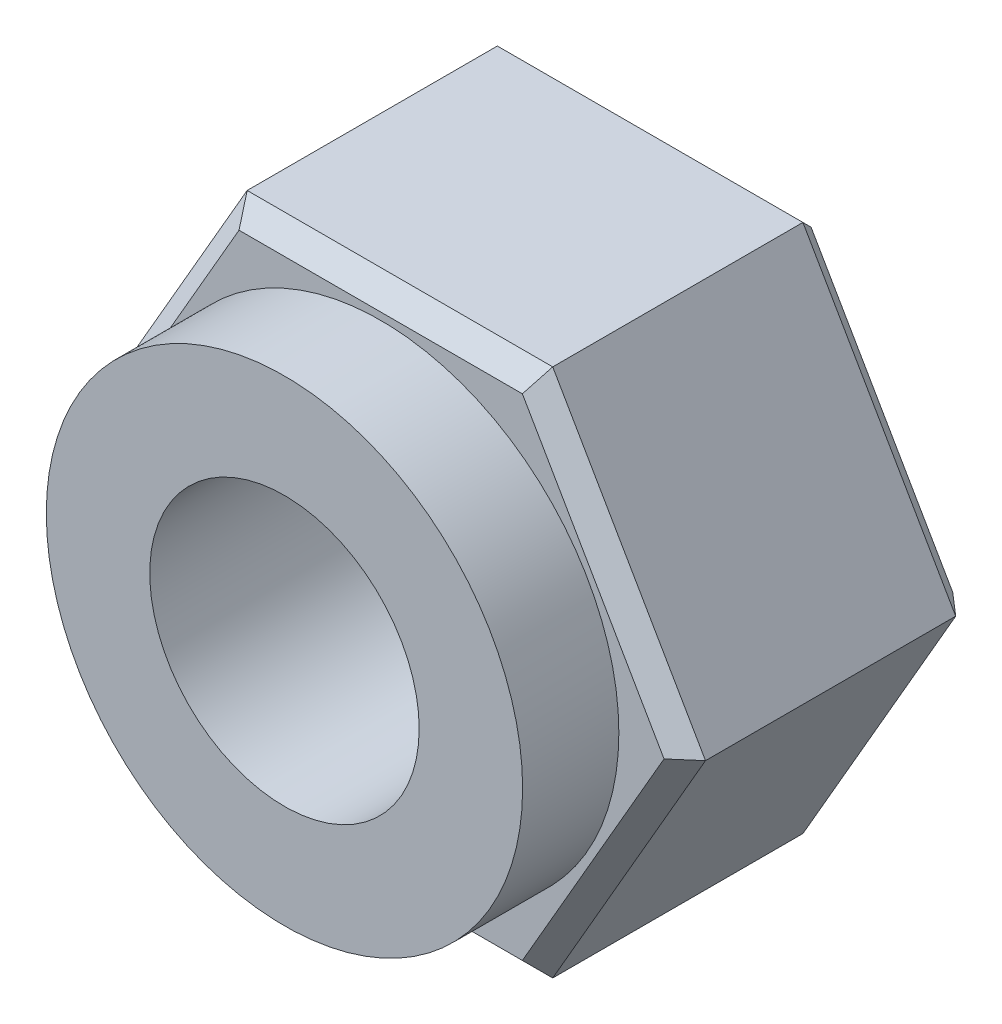
ISO-10303-21;
HEADER;
FILE_DESCRIPTION(('STEP AP214'),'2;1');
FILE_NAME('part.step','',(''),(''),'','','');
FILE_SCHEMA(('AUTOMOTIVE_DESIGN { 1 0 10303 214 1 1 1 1 }'));
ENDSEC;
DATA;
#1=APPLICATION_CONTEXT('core data for automotive mechanical design processes');
#2=APPLICATION_PROTOCOL_DEFINITION('international standard','automotive_design',2000,#1);
#3=PRODUCT_CONTEXT('',#1,'mechanical');
#4=PRODUCT('Part','Part','',(#3));
#5=PRODUCT_RELATED_PRODUCT_CATEGORY('part','',(#4));
#6=PRODUCT_DEFINITION_FORMATION('','',#4);
#7=PRODUCT_DEFINITION_CONTEXT('part definition',#1,'design');
#8=PRODUCT_DEFINITION('design','',#6,#7);
#9=PRODUCT_DEFINITION_SHAPE('','',#8);
#10=(LENGTH_UNIT() NAMED_UNIT(*) SI_UNIT(.MILLI.,.METRE.));
#11=(NAMED_UNIT(*) PLANE_ANGLE_UNIT() SI_UNIT($,.RADIAN.));
#12=(NAMED_UNIT(*) SI_UNIT($,.STERADIAN.) SOLID_ANGLE_UNIT());
#13=UNCERTAINTY_MEASURE_WITH_UNIT(LENGTH_MEASURE(1.E-05),#10,'distance_accuracy_value','');
#14=(GEOMETRIC_REPRESENTATION_CONTEXT(3) GLOBAL_UNCERTAINTY_ASSIGNED_CONTEXT((#13)) GLOBAL_UNIT_ASSIGNED_CONTEXT((#10,
#11,#12)) REPRESENTATION_CONTEXT('',''));
#15=CARTESIAN_POINT('',(0.,0.,0.));
#16=DIRECTION('',(0.,0.,1.));
#17=DIRECTION('',(1.,0.,0.));
#18=AXIS2_PLACEMENT_3D('',#15,#16,#17);
#19=CARTESIAN_POINT('',(1.5877132402715,-2.74999999999998,3.));
#20=DIRECTION('',(-0.866025403784441,0.499999999999995,0.));
#21=DIRECTION('',(-0.499999999999995,-0.866025403784441,0.));
#22=AXIS2_PLACEMENT_3D('',#19,#20,#21);
#23=PLANE('',#22);
#24=DIRECTION('',(0.,0.,-1.));
#25=VECTOR('',#24,1.);
#26=CARTESIAN_POINT('',(1.5877132402715,-2.74999999999998,3.));
#27=LINE('',#26,#25);
#28=CARTESIAN_POINT('',(1.5877132402715,-2.74999999999998,2.8));
#29=VERTEX_POINT('',#28);
#30=CARTESIAN_POINT('',(1.5877132402715,-2.74999999999998,0.200000000000001));
#31=VERTEX_POINT('',#30);
#32=EDGE_CURVE('E209',#29,#31,#27,.T.);
#33=ORIENTED_EDGE('',*,*,#32,.T.);
#34=DIRECTION('',(0.499999999999995,0.866025403784441,0.));
#35=VECTOR('',#34,1.);
#36=CARTESIAN_POINT('',(1.5877132402715,-2.74999999999998,0.200000000000001));
#37=LINE('',#36,#35);
#38=CARTESIAN_POINT('',(3.17542648054294,0.,0.200000000000001));
#39=VERTEX_POINT('',#38);
#40=EDGE_CURVE('E154',#31,#39,#37,.T.);
#41=ORIENTED_EDGE('',*,*,#40,.T.);
#42=DIRECTION('',(0.,0.,-1.));
#43=VECTOR('',#42,1.);
#44=CARTESIAN_POINT('',(3.17542648054294,0.,3.));
#45=LINE('',#44,#43);
#46=CARTESIAN_POINT('',(3.17542648054294,0.,2.8));
#47=VERTEX_POINT('',#46);
#48=EDGE_CURVE('E138',#47,#39,#45,.T.);
#49=ORIENTED_EDGE('',*,*,#48,.F.);
#50=DIRECTION('',(-0.499999999999995,-0.866025403784441,0.));
#51=VECTOR('',#50,1.);
#52=CARTESIAN_POINT('',(1.5877132402715,-2.74999999999998,2.8));
#53=LINE('',#52,#51);
#54=EDGE_CURVE('E151',#47,#29,#53,.T.);
#55=ORIENTED_EDGE('',*,*,#54,.T.);
#56=EDGE_LOOP('',(#33,#41,#49,#55));
#57=FACE_BOUND('',#56,.T.);
#58=ADVANCED_FACE('F40',(#57),#23,.F.);
#59=CARTESIAN_POINT('',(3.17542648054294,0.,3.));
#60=DIRECTION('',(-0.866025403784438,-0.500000000000001,0.));
#61=DIRECTION('',(0.500000000000001,-0.866025403784438,0.));
#62=AXIS2_PLACEMENT_3D('',#59,#60,#61);
#63=PLANE('',#62);
#64=ORIENTED_EDGE('',*,*,#48,.T.);
#65=DIRECTION('',(-0.500000000000001,0.866025403784438,0.));
#66=VECTOR('',#65,1.);
#67=CARTESIAN_POINT('',(3.17542648054294,0.,0.200000000000001));
#68=LINE('',#67,#66);
#69=CARTESIAN_POINT('',(1.58771324027146,2.75,0.200000000000001));
#70=VERTEX_POINT('',#69);
#71=EDGE_CURVE('E144',#39,#70,#68,.T.);
#72=ORIENTED_EDGE('',*,*,#71,.T.);
#73=DIRECTION('',(0.,0.,-1.));
#74=VECTOR('',#73,1.);
#75=CARTESIAN_POINT('',(1.58771324027146,2.75,3.));
#76=LINE('',#75,#74);
#77=CARTESIAN_POINT('',(1.58771324027146,2.75,2.8));
#78=VERTEX_POINT('',#77);
#79=EDGE_CURVE('E140',#78,#70,#76,.T.);
#80=ORIENTED_EDGE('',*,*,#79,.F.);
#81=DIRECTION('',(0.500000000000001,-0.866025403784438,0.));
#82=VECTOR('',#81,1.);
#83=CARTESIAN_POINT('',(3.17542648054294,0.,2.8));
#84=LINE('',#83,#82);
#85=EDGE_CURVE('E135',#78,#47,#84,.T.);
#86=ORIENTED_EDGE('',*,*,#85,.T.);
#87=EDGE_LOOP('',(#64,#72,#80,#86));
#88=FACE_BOUND('',#87,.T.);
#89=ADVANCED_FACE('F137',(#88),#63,.F.);
#90=CARTESIAN_POINT('',(1.58771324027146,2.75,3.));
#91=DIRECTION('',(0.,-1.,0.));
#92=DIRECTION('',(1.,0.,0.));
#93=AXIS2_PLACEMENT_3D('',#90,#91,#92);
#94=PLANE('',#93);
#95=ORIENTED_EDGE('',*,*,#79,.T.);
#96=DIRECTION('',(-1.,0.,0.));
#97=VECTOR('',#96,1.);
#98=CARTESIAN_POINT('',(1.58771324027146,2.75,0.200000000000001));
#99=LINE('',#98,#97);
#100=CARTESIAN_POINT('',(-1.58771324027148,2.74999999999999,0.200000000000001));
#101=VERTEX_POINT('',#100);
#102=EDGE_CURVE('E243',#70,#101,#99,.T.);
#103=ORIENTED_EDGE('',*,*,#102,.T.);
#104=DIRECTION('',(0.,0.,-1.));
#105=VECTOR('',#104,1.);
#106=CARTESIAN_POINT('',(-1.58771324027148,2.74999999999999,3.));
#107=LINE('',#106,#105);
#108=CARTESIAN_POINT('',(-1.58771324027148,2.74999999999999,2.8));
#109=VERTEX_POINT('',#108);
#110=EDGE_CURVE('E223',#109,#101,#107,.T.);
#111=ORIENTED_EDGE('',*,*,#110,.F.);
#112=DIRECTION('',(1.,0.,0.));
#113=VECTOR('',#112,1.);
#114=CARTESIAN_POINT('',(1.58771324027146,2.75,2.8));
#115=LINE('',#114,#113);
#116=EDGE_CURVE('E241',#109,#78,#115,.T.);
#117=ORIENTED_EDGE('',*,*,#116,.T.);
#118=EDGE_LOOP('',(#95,#103,#111,#117));
#119=FACE_BOUND('',#118,.T.);
#120=ADVANCED_FACE('F292',(#119),#94,.F.);
#121=CARTESIAN_POINT('',(-1.58771324027148,2.74999999999999,3.));
#122=DIRECTION('',(0.866025403784442,-0.499999999999995,0.));
#123=DIRECTION('',(0.499999999999995,0.866025403784442,0.));
#124=AXIS2_PLACEMENT_3D('',#121,#122,#123);
#125=PLANE('',#124);
#126=ORIENTED_EDGE('',*,*,#110,.T.);
#127=DIRECTION('',(-0.499999999999995,-0.866025403784442,0.));
#128=VECTOR('',#127,1.);
#129=CARTESIAN_POINT('',(-1.58771324027148,2.74999999999999,0.200000000000001));
#130=LINE('',#129,#128);
#131=CARTESIAN_POINT('',(-3.17542648054294,0.,0.200000000000001));
#132=VERTEX_POINT('',#131);
#133=EDGE_CURVE('E247',#101,#132,#130,.T.);
#134=ORIENTED_EDGE('',*,*,#133,.T.);
#135=DIRECTION('',(0.,0.,-1.));
#136=VECTOR('',#135,1.);
#137=CARTESIAN_POINT('',(-3.17542648054294,0.,3.));
#138=LINE('',#137,#136);
#139=CARTESIAN_POINT('',(-3.17542648054294,0.,2.8));
#140=VERTEX_POINT('',#139);
#141=EDGE_CURVE('E218',#140,#132,#138,.T.);
#142=ORIENTED_EDGE('',*,*,#141,.F.);
#143=DIRECTION('',(0.499999999999995,0.866025403784442,0.));
#144=VECTOR('',#143,1.);
#145=CARTESIAN_POINT('',(-1.58771324027148,2.74999999999999,2.8));
#146=LINE('',#145,#144);
#147=EDGE_CURVE('E245',#140,#109,#146,.T.);
#148=ORIENTED_EDGE('',*,*,#147,.T.);
#149=EDGE_LOOP('',(#126,#134,#142,#148));
#150=FACE_BOUND('',#149,.T.);
#151=ADVANCED_FACE('F515',(#150),#125,.F.);
#152=CARTESIAN_POINT('',(-3.17542648054294,0.,3.));
#153=DIRECTION('',(0.866025403784434,0.500000000000007,0.));
#154=DIRECTION('',(-0.500000000000007,0.866025403784435,0.));
#155=AXIS2_PLACEMENT_3D('',#152,#153,#154);
#156=PLANE('',#155);
#157=ORIENTED_EDGE('',*,*,#141,.T.);
#158=DIRECTION('',(0.500000000000007,-0.866025403784435,0.));
#159=VECTOR('',#158,1.);
#160=CARTESIAN_POINT('',(-3.17542648054294,0.,0.200000000000001));
#161=LINE('',#160,#159);
#162=CARTESIAN_POINT('',(-1.58771324027145,-2.75000000000001,0.200000000000001));
#163=VERTEX_POINT('',#162);
#164=EDGE_CURVE('E251',#132,#163,#161,.T.);
#165=ORIENTED_EDGE('',*,*,#164,.T.);
#166=DIRECTION('',(0.,0.,-1.));
#167=VECTOR('',#166,1.);
#168=CARTESIAN_POINT('',(-1.58771324027145,-2.75000000000001,3.));
#169=LINE('',#168,#167);
#170=CARTESIAN_POINT('',(-1.58771324027145,-2.75000000000001,2.8));
#171=VERTEX_POINT('',#170);
#172=EDGE_CURVE('E214',#171,#163,#169,.T.);
#173=ORIENTED_EDGE('',*,*,#172,.F.);
#174=DIRECTION('',(-0.500000000000007,0.866025403784435,0.));
#175=VECTOR('',#174,1.);
#176=CARTESIAN_POINT('',(-3.17542648054294,0.,2.8));
#177=LINE('',#176,#175);
#178=EDGE_CURVE('E249',#171,#140,#177,.T.);
#179=ORIENTED_EDGE('',*,*,#178,.T.);
#180=EDGE_LOOP('',(#157,#165,#173,#179));
#181=FACE_BOUND('',#180,.T.);
#182=ADVANCED_FACE('F274',(#181),#156,.F.);
#183=CARTESIAN_POINT('',(-1.58771324027145,-2.75000000000001,3.));
#184=DIRECTION('',(0.,1.,0.));
#185=DIRECTION('',(-1.,0.,0.));
#186=AXIS2_PLACEMENT_3D('',#183,#184,#185);
#187=PLANE('',#186);
#188=ORIENTED_EDGE('',*,*,#172,.T.);
#189=DIRECTION('',(1.,0.,0.));
#190=VECTOR('',#189,1.);
#191=CARTESIAN_POINT('',(-1.58771324027145,-2.75000000000001,0.200000000000001));
#192=LINE('',#191,#190);
#193=EDGE_CURVE('E255',#163,#31,#192,.T.);
#194=ORIENTED_EDGE('',*,*,#193,.T.);
#195=ORIENTED_EDGE('',*,*,#32,.F.);
#196=DIRECTION('',(-1.,0.,0.));
#197=VECTOR('',#196,1.);
#198=CARTESIAN_POINT('',(-1.58771324027145,-2.75000000000001,2.8));
#199=LINE('',#198,#197);
#200=EDGE_CURVE('E253',#29,#171,#199,.T.);
#201=ORIENTED_EDGE('',*,*,#200,.T.);
#202=EDGE_LOOP('',(#188,#194,#195,#201));
#203=FACE_BOUND('',#202,.T.);
#204=ADVANCED_FACE('F271',(#203),#187,.F.);
#205=CARTESIAN_POINT('',(0.,0.,3.));
#206=DIRECTION('',(0.,0.,1.));
#207=DIRECTION('',(1.,0.,0.));
#208=AXIS2_PLACEMENT_3D('',#205,#206,#207);
#209=PLANE('',#208);
#210=CARTESIAN_POINT('',(0.,0.,3.));
#211=DIRECTION('',(0.,0.,1.));
#212=DIRECTION('',(1.,0.,0.));
#213=AXIS2_PLACEMENT_3D('',#210,#211,#212);
#214=CIRCLE('',#213,2.475);
#215=CARTESIAN_POINT('',(2.475,0.,3.));
#216=VERTEX_POINT('',#215);
#217=EDGE_CURVE('E11',#216,#216,#214,.T.);
#218=ORIENTED_EDGE('',*,*,#217,.F.);
#219=EDGE_LOOP('',(#218));
#220=FACE_BOUND('',#219,.T.);
#221=DIRECTION('',(1.,0.,0.));
#222=VECTOR('',#221,1.);
#223=CARTESIAN_POINT('',(1.5877132402715,-2.54999999999998,3.));
#224=LINE('',#223,#222);
#225=CARTESIAN_POINT('',(-1.47224318643352,-2.55000000000001,3.));
#226=VERTEX_POINT('',#225);
#227=CARTESIAN_POINT('',(1.47224318643358,-2.54999999999998,3.));
#228=VERTEX_POINT('',#227);
#229=EDGE_CURVE('E257',#226,#228,#224,.T.);
#230=ORIENTED_EDGE('',*,*,#229,.T.);
#231=DIRECTION('',(0.499999999999995,0.866025403784441,0.));
#232=VECTOR('',#231,1.);
#233=CARTESIAN_POINT('',(3.00222139978605,0.0999999999999995,3.));
#234=LINE('',#233,#232);
#235=CARTESIAN_POINT('',(2.94448637286709,0.,3.));
#236=VERTEX_POINT('',#235);
#237=EDGE_CURVE('E50',#228,#236,#234,.T.);
#238=ORIENTED_EDGE('',*,*,#237,.T.);
#239=DIRECTION('',(-0.500000000000001,0.866025403784438,0.));
#240=VECTOR('',#239,1.);
#241=CARTESIAN_POINT('',(1.41450815951458,2.65,3.));
#242=LINE('',#241,#240);
#243=CARTESIAN_POINT('',(1.47224318643354,2.55,3.));
#244=VERTEX_POINT('',#243);
#245=EDGE_CURVE('E65',#236,#244,#242,.T.);
#246=ORIENTED_EDGE('',*,*,#245,.T.);
#247=DIRECTION('',(-1.,0.,0.));
#248=VECTOR('',#247,1.);
#249=CARTESIAN_POINT('',(-1.58771324027148,2.54999999999999,3.));
#250=LINE('',#249,#248);
#251=CARTESIAN_POINT('',(-1.47224318643356,2.54999999999999,3.));
#252=VERTEX_POINT('',#251);
#253=EDGE_CURVE('E263',#244,#252,#250,.T.);
#254=ORIENTED_EDGE('',*,*,#253,.T.);
#255=DIRECTION('',(-0.499999999999995,-0.866025403784442,0.));
#256=VECTOR('',#255,1.);
#257=CARTESIAN_POINT('',(-3.00222139978605,-0.100000000000022,3.));
#258=LINE('',#257,#256);
#259=CARTESIAN_POINT('',(-2.94448637286709,0.,3.));
#260=VERTEX_POINT('',#259);
#261=EDGE_CURVE('E261',#252,#260,#258,.T.);
#262=ORIENTED_EDGE('',*,*,#261,.T.);
#263=DIRECTION('',(0.500000000000007,-0.866025403784435,0.));
#264=VECTOR('',#263,1.);
#265=CARTESIAN_POINT('',(-1.41450815951456,-2.65000000000001,3.));
#266=LINE('',#265,#264);
#267=EDGE_CURVE('E259',#260,#226,#266,.T.);
#268=ORIENTED_EDGE('',*,*,#267,.T.);
#269=EDGE_LOOP('',(#230,#238,#246,#254,#262,#268));
#270=FACE_BOUND('',#269,.T.);
#271=ADVANCED_FACE('F264',(#220,#270),#209,.T.);
#272=CARTESIAN_POINT('',(0.,0.,0.));
#273=DIRECTION('',(0.,0.,1.));
#274=DIRECTION('',(1.,0.,0.));
#275=AXIS2_PLACEMENT_3D('',#272,#273,#274);
#276=PLANE('',#275);
#277=CARTESIAN_POINT('',(0.,0.,0.));
#278=DIRECTION('',(0.,0.,1.));
#279=DIRECTION('',(1.,0.,0.));
#280=AXIS2_PLACEMENT_3D('',#277,#278,#279);
#281=CIRCLE('',#280,1.4);
#282=CARTESIAN_POINT('',(1.4,0.,0.));
#283=VERTEX_POINT('',#282);
#284=EDGE_CURVE('E578',#283,#283,#281,.T.);
#285=ORIENTED_EDGE('',*,*,#284,.T.);
#286=EDGE_LOOP('',(#285));
#287=FACE_BOUND('',#286,.T.);
#288=DIRECTION('',(0.500000000000001,-0.866025403784438,0.));
#289=VECTOR('',#288,1.);
#290=CARTESIAN_POINT('',(2.20836477965031,1.275,0.));
#291=LINE('',#290,#289);
#292=CARTESIAN_POINT('',(1.47224318643354,2.55,0.));
#293=VERTEX_POINT('',#292);
#294=CARTESIAN_POINT('',(2.94448637286709,0.,0.));
#295=VERTEX_POINT('',#294);
#296=EDGE_CURVE('E236',#293,#295,#291,.T.);
#297=ORIENTED_EDGE('',*,*,#296,.T.);
#298=DIRECTION('',(-0.499999999999995,-0.866025403784441,0.));
#299=VECTOR('',#298,1.);
#300=CARTESIAN_POINT('',(2.20836477965033,-1.27499999999999,0.));
#301=LINE('',#300,#299);
#302=CARTESIAN_POINT('',(1.47224318643358,-2.54999999999998,0.));
#303=VERTEX_POINT('',#302);
#304=EDGE_CURVE('E145',#295,#303,#301,.T.);
#305=ORIENTED_EDGE('',*,*,#304,.T.);
#306=DIRECTION('',(-1.,0.,0.));
#307=VECTOR('',#306,1.);
#308=CARTESIAN_POINT('',(0.,-2.55,0.));
#309=LINE('',#308,#307);
#310=CARTESIAN_POINT('',(-1.47224318643352,-2.55000000000001,0.));
#311=VERTEX_POINT('',#310);
#312=EDGE_CURVE('E228',#303,#311,#309,.T.);
#313=ORIENTED_EDGE('',*,*,#312,.T.);
#314=DIRECTION('',(-0.500000000000007,0.866025403784435,0.));
#315=VECTOR('',#314,1.);
#316=CARTESIAN_POINT('',(-2.20836477965031,-1.27500000000002,0.));
#317=LINE('',#316,#315);
#318=CARTESIAN_POINT('',(-2.94448637286709,0.,0.));
#319=VERTEX_POINT('',#318);
#320=EDGE_CURVE('E230',#311,#319,#317,.T.);
#321=ORIENTED_EDGE('',*,*,#320,.T.);
#322=DIRECTION('',(0.499999999999995,0.866025403784442,0.));
#323=VECTOR('',#322,1.);
#324=CARTESIAN_POINT('',(-2.20836477965032,1.27499999999999,0.));
#325=LINE('',#324,#323);
#326=CARTESIAN_POINT('',(-1.47224318643356,2.54999999999999,0.));
#327=VERTEX_POINT('',#326);
#328=EDGE_CURVE('E232',#319,#327,#325,.T.);
#329=ORIENTED_EDGE('',*,*,#328,.T.);
#330=DIRECTION('',(1.,0.,0.));
#331=VECTOR('',#330,1.);
#332=CARTESIAN_POINT('',(0.,2.55,0.));
#333=LINE('',#332,#331);
#334=EDGE_CURVE('E234',#327,#293,#333,.T.);
#335=ORIENTED_EDGE('',*,*,#334,.T.);
#336=EDGE_LOOP('',(#297,#305,#313,#321,#329,#335));
#337=FACE_BOUND('',#336,.T.);
#338=ADVANCED_FACE('F333',(#287,#337),#276,.F.);
#339=CARTESIAN_POINT('',(-1.58771324027148,2.74999999999999,0.200000000000001));
#340=DIRECTION('',(0.612372435695797,-0.35355339059327,0.707106781186547));
#341=DIRECTION('',(-0.499999999999995,-0.866025403784442,0.));
#342=AXIS2_PLACEMENT_3D('',#339,#340,#341);
#343=PLANE('',#342);
#344=DIRECTION('',(0.37796447300923,-0.654653670707976,-0.654653670707977));
#345=VECTOR('',#344,1.);
#346=CARTESIAN_POINT('',(-1.58771324027148,2.74999999999999,0.200000000000001));
#347=LINE('',#346,#345);
#348=EDGE_CURVE('E202',#327,#101,#347,.F.);
#349=ORIENTED_EDGE('',*,*,#348,.F.);
#350=ORIENTED_EDGE('',*,*,#328,.F.);
#351=DIRECTION('',(0.755928946018454,0.,-0.654653670707977));
#352=VECTOR('',#351,1.);
#353=CARTESIAN_POINT('',(-3.17542648054294,0.,0.200000000000001));
#354=LINE('',#353,#352);
#355=EDGE_CURVE('E170',#132,#319,#354,.T.);
#356=ORIENTED_EDGE('',*,*,#355,.F.);
#357=ORIENTED_EDGE('',*,*,#133,.F.);
#358=EDGE_LOOP('',(#349,#350,#356,#357));
#359=FACE_BOUND('',#358,.T.);
#360=ADVANCED_FACE('F328',(#359),#343,.F.);
#361=CARTESIAN_POINT('',(-3.17542648054294,0.,0.200000000000001));
#362=DIRECTION('',(0.612372435695792,0.353553390593279,0.707106781186547));
#363=DIRECTION('',(0.500000000000007,-0.866025403784435,0.));
#364=AXIS2_PLACEMENT_3D('',#361,#362,#363);
#365=PLANE('',#364);
#366=ORIENTED_EDGE('',*,*,#355,.T.);
#367=ORIENTED_EDGE('',*,*,#320,.F.);
#368=DIRECTION('',(0.37796447300922,0.654653670707981,-0.654653670707977));
#369=VECTOR('',#368,1.);
#370=CARTESIAN_POINT('',(-1.58771324027145,-2.75000000000001,0.200000000000001));
#371=LINE('',#370,#369);
#372=EDGE_CURVE('E200',#163,#311,#371,.T.);
#373=ORIENTED_EDGE('',*,*,#372,.F.);
#374=ORIENTED_EDGE('',*,*,#164,.F.);
#375=EDGE_LOOP('',(#366,#367,#373,#374));
#376=FACE_BOUND('',#375,.T.);
#377=ADVANCED_FACE('F322',(#376),#365,.F.);
#378=CARTESIAN_POINT('',(1.58771324027146,2.75,0.200000000000001));
#379=DIRECTION('',(0.,-0.707106781186547,0.707106781186547));
#380=DIRECTION('',(-1.,0.,0.));
#381=AXIS2_PLACEMENT_3D('',#378,#379,#380);
#382=PLANE('',#381);
#383=ORIENTED_EDGE('',*,*,#348,.T.);
#384=ORIENTED_EDGE('',*,*,#102,.F.);
#385=DIRECTION('',(-0.377964473009225,-0.654653670707978,-0.654653670707977));
#386=VECTOR('',#385,1.);
#387=CARTESIAN_POINT('',(1.58771324027146,2.75,0.200000000000001));
#388=LINE('',#387,#386);
#389=EDGE_CURVE('E193',#293,#70,#388,.F.);
#390=ORIENTED_EDGE('',*,*,#389,.F.);
#391=ORIENTED_EDGE('',*,*,#334,.F.);
#392=EDGE_LOOP('',(#383,#384,#390,#391));
#393=FACE_BOUND('',#392,.T.);
#394=ADVANCED_FACE('F315',(#393),#382,.F.);
#395=CARTESIAN_POINT('',(-1.58771324027145,-2.75000000000001,0.200000000000001));
#396=DIRECTION('',(0.,0.707106781186547,0.707106781186547));
#397=DIRECTION('',(1.,0.,0.));
#398=AXIS2_PLACEMENT_3D('',#395,#396,#397);
#399=PLANE('',#398);
#400=ORIENTED_EDGE('',*,*,#372,.T.);
#401=ORIENTED_EDGE('',*,*,#312,.F.);
#402=DIRECTION('',(0.377964473009231,-0.654653670707974,0.654653670707978));
#403=VECTOR('',#402,1.);
#404=CARTESIAN_POINT('',(1.13408088590822,-1.9642857142857,-0.585714285714281));
#405=LINE('',#404,#403);
#406=EDGE_CURVE('E187',#31,#303,#405,.F.);
#407=ORIENTED_EDGE('',*,*,#406,.F.);
#408=ORIENTED_EDGE('',*,*,#193,.F.);
#409=EDGE_LOOP('',(#400,#401,#407,#408));
#410=FACE_BOUND('',#409,.T.);
#411=ADVANCED_FACE('F308',(#410),#399,.F.);
#412=CARTESIAN_POINT('',(3.17542648054294,0.,0.200000000000001));
#413=DIRECTION('',(-0.612372435695795,-0.353553390593275,0.707106781186547));
#414=DIRECTION('',(-0.500000000000001,0.866025403784438,0.));
#415=AXIS2_PLACEMENT_3D('',#412,#413,#414);
#416=PLANE('',#415);
#417=ORIENTED_EDGE('',*,*,#389,.T.);
#418=ORIENTED_EDGE('',*,*,#71,.F.);
#419=DIRECTION('',(-0.755928946018454,0.,-0.654653670707978));
#420=VECTOR('',#419,1.);
#421=CARTESIAN_POINT('',(3.17542648054294,0.,0.200000000000001));
#422=LINE('',#421,#420);
#423=EDGE_CURVE('E182',#295,#39,#422,.F.);
#424=ORIENTED_EDGE('',*,*,#423,.F.);
#425=ORIENTED_EDGE('',*,*,#296,.F.);
#426=EDGE_LOOP('',(#417,#418,#424,#425));
#427=FACE_BOUND('',#426,.T.);
#428=ADVANCED_FACE('F302',(#427),#416,.F.);
#429=CARTESIAN_POINT('',(1.5877132402715,-2.74999999999998,0.200000000000001));
#430=DIRECTION('',(-0.612372435695797,0.353553390593271,0.707106781186547));
#431=DIRECTION('',(0.499999999999995,0.866025403784441,0.));
#432=AXIS2_PLACEMENT_3D('',#429,#430,#431);
#433=PLANE('',#432);
#434=ORIENTED_EDGE('',*,*,#406,.T.);
#435=ORIENTED_EDGE('',*,*,#304,.F.);
#436=ORIENTED_EDGE('',*,*,#423,.T.);
#437=ORIENTED_EDGE('',*,*,#40,.F.);
#438=EDGE_LOOP('',(#434,#435,#436,#437));
#439=FACE_BOUND('',#438,.T.);
#440=ADVANCED_FACE('F284',(#439),#433,.F.);
#441=CARTESIAN_POINT('',(-2.20836477965032,1.27499999999999,3.));
#442=DIRECTION('',(-0.612372435695797,0.35355339059327,0.707106781186547));
#443=DIRECTION('',(0.499999999999995,0.866025403784442,0.));
#444=AXIS2_PLACEMENT_3D('',#441,#442,#443);
#445=PLANE('',#444);
#446=DIRECTION('',(-0.37796447300923,0.654653670707976,-0.654653670707977));
#447=VECTOR('',#446,1.);
#448=CARTESIAN_POINT('',(-1.26192273122876,2.18571428571428,3.36428571428572));
#449=LINE('',#448,#447);
#450=EDGE_CURVE('E176',#109,#252,#449,.F.);
#451=ORIENTED_EDGE('',*,*,#450,.F.);
#452=ORIENTED_EDGE('',*,*,#147,.F.);
#453=DIRECTION('',(-0.755928946018454,0.,-0.654653670707977));
#454=VECTOR('',#453,1.);
#455=CARTESIAN_POINT('',(-2.5238454624575,0.,3.36428571428572));
#456=LINE('',#455,#454);
#457=EDGE_CURVE('E45',#260,#140,#456,.T.);
#458=ORIENTED_EDGE('',*,*,#457,.F.);
#459=ORIENTED_EDGE('',*,*,#261,.F.);
#460=EDGE_LOOP('',(#451,#452,#458,#459));
#461=FACE_BOUND('',#460,.T.);
#462=ADVANCED_FACE('F43',(#461),#445,.T.);
#463=CARTESIAN_POINT('',(-2.20836477965031,-1.27500000000002,3.));
#464=DIRECTION('',(-0.612372435695792,-0.353553390593279,0.707106781186547));
#465=DIRECTION('',(-0.500000000000007,0.866025403784435,0.));
#466=AXIS2_PLACEMENT_3D('',#463,#464,#465);
#467=PLANE('',#466);
#468=ORIENTED_EDGE('',*,*,#457,.T.);
#469=ORIENTED_EDGE('',*,*,#178,.F.);
#470=DIRECTION('',(-0.37796447300922,-0.654653670707981,-0.654653670707977));
#471=VECTOR('',#470,1.);
#472=CARTESIAN_POINT('',(-1.26192273122873,-2.18571428571429,3.36428571428571));
#473=LINE('',#472,#471);
#474=EDGE_CURVE('E174',#226,#171,#473,.T.);
#475=ORIENTED_EDGE('',*,*,#474,.F.);
#476=ORIENTED_EDGE('',*,*,#267,.F.);
#477=EDGE_LOOP('',(#468,#469,#475,#476));
#478=FACE_BOUND('',#477,.T.);
#479=ADVANCED_FACE('F276',(#478),#467,.T.);
#480=CARTESIAN_POINT('',(0.,2.55,3.));
#481=DIRECTION('',(0.,0.707106781186547,0.707106781186547));
#482=DIRECTION('',(1.,0.,0.));
#483=AXIS2_PLACEMENT_3D('',#480,#481,#482);
#484=PLANE('',#483);
#485=ORIENTED_EDGE('',*,*,#450,.T.);
#486=ORIENTED_EDGE('',*,*,#253,.F.);
#487=DIRECTION('',(0.377964473009225,0.654653670707978,-0.654653670707977));
#488=VECTOR('',#487,1.);
#489=CARTESIAN_POINT('',(1.26192273122875,2.18571428571429,3.36428571428571));
#490=LINE('',#489,#488);
#491=EDGE_CURVE('E164',#78,#244,#490,.F.);
#492=ORIENTED_EDGE('',*,*,#491,.F.);
#493=ORIENTED_EDGE('',*,*,#116,.F.);
#494=EDGE_LOOP('',(#485,#486,#492,#493));
#495=FACE_BOUND('',#494,.T.);
#496=ADVANCED_FACE('F278',(#495),#484,.T.);
#497=CARTESIAN_POINT('',(0.,-2.55,3.));
#498=DIRECTION('',(0.,-0.707106781186547,0.707106781186547));
#499=DIRECTION('',(-1.,0.,0.));
#500=AXIS2_PLACEMENT_3D('',#497,#498,#499);
#501=PLANE('',#500);
#502=ORIENTED_EDGE('',*,*,#474,.T.);
#503=ORIENTED_EDGE('',*,*,#200,.F.);
#504=DIRECTION('',(-0.377964473009231,0.654653670707974,0.654653670707978));
#505=VECTOR('',#504,1.);
#506=CARTESIAN_POINT('',(1.26192273122878,-2.18571428571427,3.36428571428571));
#507=LINE('',#506,#505);
#508=EDGE_CURVE('E158',#228,#29,#507,.F.);
#509=ORIENTED_EDGE('',*,*,#508,.F.);
#510=ORIENTED_EDGE('',*,*,#229,.F.);
#511=EDGE_LOOP('',(#502,#503,#509,#510));
#512=FACE_BOUND('',#511,.T.);
#513=ADVANCED_FACE('F268',(#512),#501,.T.);
#514=CARTESIAN_POINT('',(2.20836477965031,1.275,3.));
#515=DIRECTION('',(0.612372435695795,0.353553390593275,0.707106781186547));
#516=DIRECTION('',(0.500000000000001,-0.866025403784438,0.));
#517=AXIS2_PLACEMENT_3D('',#514,#515,#516);
#518=PLANE('',#517);
#519=ORIENTED_EDGE('',*,*,#491,.T.);
#520=ORIENTED_EDGE('',*,*,#245,.F.);
#521=DIRECTION('',(0.755928946018454,0.,-0.654653670707978));
#522=VECTOR('',#521,1.);
#523=CARTESIAN_POINT('',(2.52384546245751,0.,3.36428571428571));
#524=LINE('',#523,#522);
#525=EDGE_CURVE('E58',#47,#236,#524,.F.);
#526=ORIENTED_EDGE('',*,*,#525,.F.);
#527=ORIENTED_EDGE('',*,*,#85,.F.);
#528=EDGE_LOOP('',(#519,#520,#526,#527));
#529=FACE_BOUND('',#528,.T.);
#530=ADVANCED_FACE('F161',(#529),#518,.T.);
#531=CARTESIAN_POINT('',(2.20836477965033,-1.27499999999999,3.));
#532=DIRECTION('',(0.612372435695797,-0.353553390593271,0.707106781186547));
#533=DIRECTION('',(-0.499999999999995,-0.866025403784441,0.));
#534=AXIS2_PLACEMENT_3D('',#531,#532,#533);
#535=PLANE('',#534);
#536=ORIENTED_EDGE('',*,*,#508,.T.);
#537=ORIENTED_EDGE('',*,*,#54,.F.);
#538=ORIENTED_EDGE('',*,*,#525,.T.);
#539=ORIENTED_EDGE('',*,*,#237,.F.);
#540=EDGE_LOOP('',(#536,#537,#538,#539));
#541=FACE_BOUND('',#540,.T.);
#542=ADVANCED_FACE('F156',(#541),#535,.T.);
#543=CARTESIAN_POINT('',(0.,0.,4.));
#544=DIRECTION('',(0.,0.,-1.));
#545=DIRECTION('',(-1.,0.,0.));
#546=AXIS2_PLACEMENT_3D('',#543,#544,#545);
#547=CYLINDRICAL_SURFACE('',#546,2.475);
#548=CARTESIAN_POINT('',(0.,0.,4.));
#549=DIRECTION('',(0.,0.,1.));
#550=DIRECTION('',(1.,0.,0.));
#551=AXIS2_PLACEMENT_3D('',#548,#549,#550);
#552=CIRCLE('',#551,2.475);
#553=CARTESIAN_POINT('',(2.475,0.,4.));
#554=VERTEX_POINT('',#553);
#555=EDGE_CURVE('E162',#554,#554,#552,.T.);
#556=ORIENTED_EDGE('',*,*,#555,.F.);
#557=EDGE_LOOP('',(#556));
#558=FACE_BOUND('',#557,.T.);
#559=ORIENTED_EDGE('',*,*,#217,.T.);
#560=EDGE_LOOP('',(#559));
#561=FACE_BOUND('',#560,.T.);
#562=ADVANCED_FACE('F341',(#558,#561),#547,.T.);
#563=CARTESIAN_POINT('',(0.,0.,4.));
#564=DIRECTION('',(0.,0.,1.));
#565=DIRECTION('',(1.,0.,0.));
#566=AXIS2_PLACEMENT_3D('',#563,#564,#565);
#567=PLANE('',#566);
#568=CARTESIAN_POINT('',(0.,0.,4.));
#569=DIRECTION('',(0.,0.,1.));
#570=DIRECTION('',(1.,0.,0.));
#571=AXIS2_PLACEMENT_3D('',#568,#569,#570);
#572=CIRCLE('',#571,1.4);
#573=CARTESIAN_POINT('',(1.4,0.,4.));
#574=VERTEX_POINT('',#573);
#575=EDGE_CURVE('E167',#574,#574,#572,.T.);
#576=ORIENTED_EDGE('',*,*,#575,.F.);
#577=EDGE_LOOP('',(#576));
#578=FACE_BOUND('',#577,.T.);
#579=ORIENTED_EDGE('',*,*,#555,.T.);
#580=EDGE_LOOP('',(#579));
#581=FACE_BOUND('',#580,.T.);
#582=ADVANCED_FACE('F376',(#578,#581),#567,.T.);
#583=CARTESIAN_POINT('',(0.,0.,4.));
#584=DIRECTION('',(0.,0.,-1.));
#585=DIRECTION('',(-1.,0.,0.));
#586=AXIS2_PLACEMENT_3D('',#583,#584,#585);
#587=CYLINDRICAL_SURFACE('',#586,1.4);
#588=ORIENTED_EDGE('',*,*,#575,.T.);
#589=EDGE_LOOP('',(#588));
#590=FACE_BOUND('',#589,.T.);
#591=ORIENTED_EDGE('',*,*,#284,.F.);
#592=EDGE_LOOP('',(#591));
#593=FACE_BOUND('',#592,.T.);
#594=ADVANCED_FACE('F385',(#590,#593),#587,.F.);
#595=CLOSED_SHELL('',(#58,#89,#120,#151,#182,#204,#271,#338,#360,#377,#394,#411,#428,#440,#462,
#479,#496,#513,#530,#542,#562,#582,#594));
#596=MANIFOLD_SOLID_BREP('B2',#595);
#597=ADVANCED_BREP_SHAPE_REPRESENTATION('',(#18,#596),#14);
#598=SHAPE_DEFINITION_REPRESENTATION(#9,#597);
ENDSEC;
END-ISO-10303-21;
